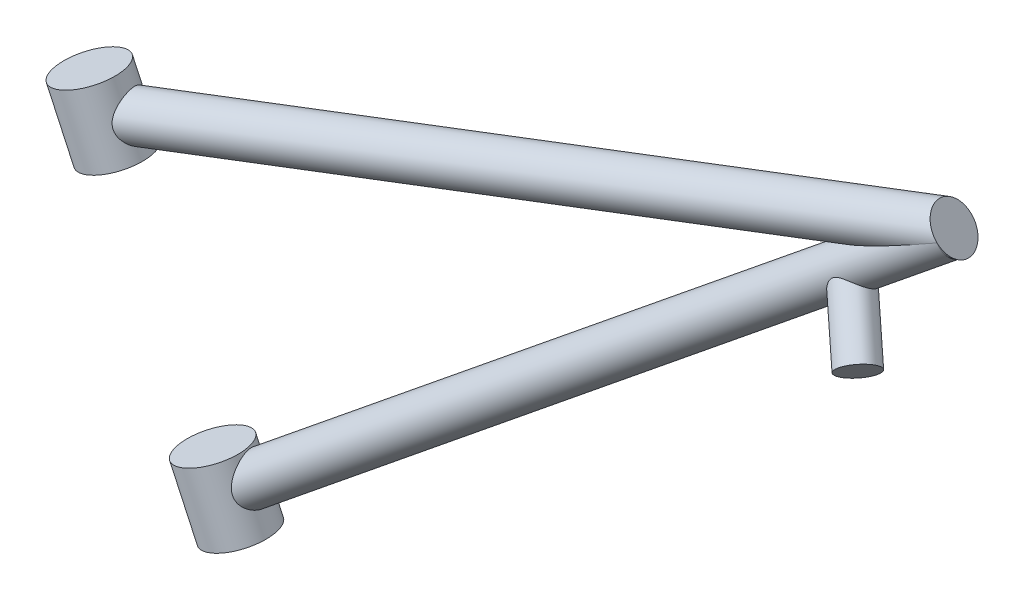
ISO-10303-21;
HEADER;
FILE_DESCRIPTION(('STEP AP214'),'2;1');
FILE_NAME('part.step','',(''),(''),'','','');
FILE_SCHEMA(('AUTOMOTIVE_DESIGN { 1 0 10303 214 1 1 1 1 }'));
ENDSEC;
DATA;
#1=APPLICATION_CONTEXT('core data for automotive mechanical design processes');
#2=APPLICATION_PROTOCOL_DEFINITION('international standard','automotive_design',2000,#1);
#3=PRODUCT_CONTEXT('',#1,'mechanical');
#4=PRODUCT('Part','Part','',(#3));
#5=PRODUCT_RELATED_PRODUCT_CATEGORY('part','',(#4));
#6=PRODUCT_DEFINITION_FORMATION('','',#4);
#7=PRODUCT_DEFINITION_CONTEXT('part definition',#1,'design');
#8=PRODUCT_DEFINITION('design','',#6,#7);
#9=PRODUCT_DEFINITION_SHAPE('','',#8);
#10=(LENGTH_UNIT() NAMED_UNIT(*) SI_UNIT(.MILLI.,.METRE.));
#11=(NAMED_UNIT(*) PLANE_ANGLE_UNIT() SI_UNIT($,.RADIAN.));
#12=(NAMED_UNIT(*) SI_UNIT($,.STERADIAN.) SOLID_ANGLE_UNIT());
#13=UNCERTAINTY_MEASURE_WITH_UNIT(LENGTH_MEASURE(1.E-05),#10,'distance_accuracy_value','');
#14=(GEOMETRIC_REPRESENTATION_CONTEXT(3) GLOBAL_UNCERTAINTY_ASSIGNED_CONTEXT((#13)) GLOBAL_UNIT_ASSIGNED_CONTEXT((#10,
#11,#12)) REPRESENTATION_CONTEXT('',''));
#15=CARTESIAN_POINT('',(0.,0.,0.));
#16=DIRECTION('',(0.,0.,1.));
#17=DIRECTION('',(1.,0.,0.));
#18=AXIS2_PLACEMENT_3D('',#15,#16,#17);
#19=CARTESIAN_POINT('',(255.,1215.1911,-261.859));
#20=DIRECTION('',(0.781537576244063,0.603543584285104,-0.157905537543319));
#21=DIRECTION('',(-0.611211710509564,0.791467147098332,0.));
#22=AXIS2_PLACEMENT_3D('',#19,#20,#21);
#23=CYLINDRICAL_SURFACE('',#22,9.52500000000002);
#24=CARTESIAN_POINT('',(493.612063998645,1390.16282339824,-303.035341507604));
#25=CARTESIAN_POINT('',(493.521655058716,1390.25973316468,-302.870801580258));
#26=CARTESIAN_POINT('',(493.42173983738,1390.35482608397,-302.710358352888));
#27=CARTESIAN_POINT('',(493.204540538591,1390.54048982308,-302.398760660696));
#28=CARTESIAN_POINT('',(493.08724399081,1390.63105733322,-302.247612976102));
#29=CARTESIAN_POINT('',(492.836827567912,1390.80710235116,-301.955030836847));
#30=CARTESIAN_POINT('',(492.703667752751,1390.89256616166,-301.813622377154));
#31=CARTESIAN_POINT('',(492.423616189445,1391.05756154742,-301.54127693571));
#32=CARTESIAN_POINT('',(492.276717717386,1391.13709018331,-301.410345140184));
#33=CARTESIAN_POINT('',(491.821378988013,1391.36437466075,-301.036130597682));
#34=CARTESIAN_POINT('',(491.495450533516,1391.50279326358,-300.808195508861));
#35=CARTESIAN_POINT('',(490.809679167949,1391.75108962571,-300.392325626896));
#36=CARTESIAN_POINT('',(490.449843081226,1391.8609731114,-300.204382809498));
#37=CARTESIAN_POINT('',(489.859595791814,1392.01015921067,-299.934618166978));
#38=CARTESIAN_POINT('',(489.63702446139,1392.05987915871,-299.841000866515));
#39=CARTESIAN_POINT('',(489.18506708919,1392.14743545838,-299.665147018175));
#40=CARTESIAN_POINT('',(488.955679705792,1392.18526945327,-299.582912729112));
#41=CARTESIAN_POINT('',(488.491570871629,1392.24778309557,-299.428751705965));
#42=CARTESIAN_POINT('',(488.256846344663,1392.2724549454,-299.356831100355));
#43=CARTESIAN_POINT('',(487.783726916595,1392.30683450842,-299.222165906311));
#44=CARTESIAN_POINT('',(487.545333046636,1392.31654635077,-299.159418790202));
#45=CARTESIAN_POINT('',(487.132247509814,1392.3182375197,-299.057878722053));
#46=CARTESIAN_POINT('',(486.958021794932,1392.31435063131,-299.017236671551));
#47=CARTESIAN_POINT('',(486.609274998456,1392.29611309351,-298.939467028408));
#48=CARTESIAN_POINT('',(486.434753869837,1392.28176058296,-298.902340062192));
#49=CARTESIAN_POINT('',(486.086780778601,1392.24106643926,-298.83103382774));
#50=CARTESIAN_POINT('',(485.9133274743,1392.21474596594,-298.796849483161));
#51=CARTESIAN_POINT('',(485.568661858649,1392.14835019628,-298.730696888654));
#52=CARTESIAN_POINT('',(485.397449508775,1392.10827513671,-298.698728600589));
#53=CARTESIAN_POINT('',(484.975749000047,1391.98866529415,-298.620928352942));
#54=CARTESIAN_POINT('',(484.727637918705,1391.89941709534,-298.576001299133));
#55=CARTESIAN_POINT('',(484.369426269337,1391.7354643508,-298.509953641844));
#56=CARTESIAN_POINT('',(484.252420895224,1391.67584930827,-298.48817551775));
#57=CARTESIAN_POINT('',(484.024121721895,1391.54635634231,-298.444961637745));
#58=CARTESIAN_POINT('',(483.912827728927,1391.47647876732,-298.423525870236));
#59=CARTESIAN_POINT('',(483.696587722169,1391.32627727787,-298.380934470149));
#60=CARTESIAN_POINT('',(483.591677606955,1391.24590108778,-298.359780865835));
#61=CARTESIAN_POINT('',(483.389742962618,1391.07566374797,-298.318043967745));
#62=CARTESIAN_POINT('',(483.292718431275,1390.98580260093,-298.29746067381));
#63=CARTESIAN_POINT('',(483.106948725856,1390.79752565859,-298.257121823));
#64=CARTESIAN_POINT('',(483.018213792169,1390.69909956511,-298.237367306102));
#65=CARTESIAN_POINT('',(482.849174198631,1390.49497330348,-298.19904596277));
#66=CARTESIAN_POINT('',(482.768874921917,1390.3892685609,-298.180479897652));
#67=CARTESIAN_POINT('',(482.590921458577,1390.13544491766,-298.138947497858));
#68=CARTESIAN_POINT('',(482.496467572134,1389.98498202238,-298.116591224952));
#69=CARTESIAN_POINT('',(482.320805669777,1389.67602565659,-298.075479229487));
#70=CARTESIAN_POINT('',(482.239605765917,1389.51752734522,-298.056725710748));
#71=CARTESIAN_POINT('',(482.088668397586,1389.19420876456,-298.023509288492));
#72=CARTESIAN_POINT('',(482.018964858196,1389.02937149406,-298.009058985888));
#73=CARTESIAN_POINT('',(481.889763411345,1388.69543989851,-297.985155040927));
#74=CARTESIAN_POINT('',(481.830265488791,1388.52634557975,-297.97570139118));
#75=CARTESIAN_POINT('',(481.689081661151,1388.08905436147,-297.958593435731));
#76=CARTESIAN_POINT('',(481.613750406785,1387.81863487524,-297.954945199087));
#77=CARTESIAN_POINT('',(481.480604135375,1387.2736908079,-297.963117704344));
#78=CARTESIAN_POINT('',(481.422798463111,1386.99916411836,-297.974946681012));
#79=CARTESIAN_POINT('',(481.322014424656,1386.44871759754,-298.015823471519));
#80=CARTESIAN_POINT('',(481.279033799852,1386.17279798497,-298.044868660613));
#81=CARTESIAN_POINT('',(481.20609125916,1385.62194599114,-298.12187061427));
#82=CARTESIAN_POINT('',(481.176124923127,1385.34701330618,-298.169820947359));
#83=CARTESIAN_POINT('',(481.131726196092,1384.8421571375,-298.277428767793));
#84=CARTESIAN_POINT('',(481.115622206209,1384.61176108527,-298.334187510939));
#85=CARTESIAN_POINT('',(481.091522519905,1384.15501717613,-298.463493942863));
#86=CARTESIAN_POINT('',(481.08352537197,1383.92866860165,-298.536038802343));
#87=CARTESIAN_POINT('',(481.075391319834,1383.48218787969,-298.697740465961));
#88=CARTESIAN_POINT('',(481.07524282507,1383.26204704543,-298.78687257937));
#89=CARTESIAN_POINT('',(481.082645531934,1382.82980543722,-298.982613645171));
#90=CARTESIAN_POINT('',(481.090194951708,1382.61770281442,-299.089218548302));
#91=CARTESIAN_POINT('',(481.110644000929,1382.24528972078,-299.297361138692));
#92=CARTESIAN_POINT('',(481.122175003088,1382.08309156331,-299.395663285991));
#93=CARTESIAN_POINT('',(481.15007737358,1381.76680764517,-299.603915294393));
#94=CARTESIAN_POINT('',(481.166447658822,1381.61272007834,-299.713862545647));
#95=CARTESIAN_POINT('',(481.203964317329,1381.31414561115,-299.945294558504));
#96=CARTESIAN_POINT('',(481.225109096941,1381.16965552808,-300.06677546253));
#97=CARTESIAN_POINT('',(481.272080250725,1380.89171336853,-300.320972877297));
#98=CARTESIAN_POINT('',(481.297906682622,1380.75826142818,-300.453689526565));
#99=CARTESIAN_POINT('',(481.354247013299,1380.50313396502,-300.730519110315));
#100=CARTESIAN_POINT('',(481.384786578338,1380.38152925879,-300.87469221183));
#101=CARTESIAN_POINT('',(481.45022468309,1380.15230292704,-301.172845672094));
#102=CARTESIAN_POINT('',(481.485123231129,1380.04468132823,-301.326826049574));
#103=CARTESIAN_POINT('',(481.558984753845,1379.84455694181,-301.643354174111));
#104=CARTESIAN_POINT('',(481.597946923143,1379.75205116766,-301.805900220365));
#105=CARTESIAN_POINT('',(481.679599252123,1379.58294204883,-302.138158597655));
#106=CARTESIAN_POINT('',(481.722289187612,1379.50633774875,-302.307870497409));
#107=CARTESIAN_POINT('',(481.807017820279,1379.37564742416,-302.637334939676));
#108=CARTESIAN_POINT('',(481.848768329743,1379.32015399787,-302.796606198275));
#109=CARTESIAN_POINT('',(481.934770483422,1379.22275122879,-303.118645310648));
#110=CARTESIAN_POINT('',(481.97902295411,1379.18084640588,-303.281414308691));
#111=CARTESIAN_POINT('',(482.069722459258,1379.11050849032,-303.609165298562));
#112=CARTESIAN_POINT('',(482.116168809514,1379.08207122766,-303.774146589097));
#113=CARTESIAN_POINT('',(482.211032565098,1379.03829399321,-304.105326119201));
#114=CARTESIAN_POINT('',(482.259450705741,1379.0229589552,-304.271524793448));
#115=CARTESIAN_POINT('',(482.360896262887,1379.00438748012,-304.613757522003));
#116=CARTESIAN_POINT('',(482.41402799941,1379.00190625667,-304.789801634881));
#117=CARTESIAN_POINT('',(482.522050776636,1379.01035875332,-305.14104826562));
#118=CARTESIAN_POINT('',(482.576942501427,1379.02129775282,-305.316250425037));
#119=CARTESIAN_POINT('',(482.74405837665,1379.07310919261,-305.839267150163));
#120=CARTESIAN_POINT('',(482.858747238726,1379.13297238254,-306.184573353803));
#121=CARTESIAN_POINT('',(483.063633692703,1379.27543651032,-306.774097307754));
#122=CARTESIAN_POINT('',(483.152475757823,1379.34812449933,-307.021321624553));
#123=CARTESIAN_POINT('',(483.333888817275,1379.51509203442,-307.506991111299));
#124=CARTESIAN_POINT('',(483.426459955824,1379.60937241624,-307.745435941023));
#125=CARTESIAN_POINT('',(483.616256506009,1379.81739720676,-308.212494610135));
#126=CARTESIAN_POINT('',(483.713492870374,1379.93118921349,-308.441082655991));
#127=CARTESIAN_POINT('',(483.913602564165,1380.17585233902,-308.886257948464));
#128=CARTESIAN_POINT('',(484.016474441523,1380.30671907019,-309.102848257804));
#129=CARTESIAN_POINT('',(484.2129330345,1380.56170069248,-309.489336849047));
#130=CARTESIAN_POINT('',(484.305437711576,1380.68364374216,-309.661223224987));
#131=CARTESIAN_POINT('',(484.497308179672,1380.93695879802,-309.993955982227));
#132=CARTESIAN_POINT('',(484.596675193763,1381.06833248519,-310.154800385281));
#133=CARTESIAN_POINT('',(484.803993937122,1381.33875551178,-310.463206223301));
#134=CARTESIAN_POINT('',(484.911923031957,1381.47778433473,-310.610800617257));
#135=CARTESIAN_POINT('',(485.138940284887,1381.76195490817,-310.890514760614));
#136=CARTESIAN_POINT('',(485.258020799941,1381.90709243482,-311.022644971243));
#137=CARTESIAN_POINT('',(485.535952201405,1382.23116486421,-311.292977091721));
#138=CARTESIAN_POINT('',(485.697975807171,1382.41099889442,-311.42700309783));
#139=CARTESIAN_POINT('',(485.959084509026,1382.68004050759,-311.601316112062));
#140=CARTESIAN_POINT('',(486.049066428246,1382.7695428933,-311.654939036454));
#141=CARTESIAN_POINT('',(486.235273324489,1382.94739278814,-311.752280502494));
#142=CARTESIAN_POINT('',(486.33149501966,1383.03574087548,-311.796004197223));
#143=CARTESIAN_POINT('',(486.53105351222,1383.21117244031,-311.873021512153));
#144=CARTESIAN_POINT('',(486.634453064138,1383.29823371291,-311.906203775642));
#145=CARTESIAN_POINT('',(486.846843659751,1383.46914945349,-311.960874292487));
#146=CARTESIAN_POINT('',(486.955834392663,1383.55300409926,-311.982363195045));
#147=CARTESIAN_POINT('',(487.178468930265,1383.71680226943,-312.013476153304));
#148=CARTESIAN_POINT('',(487.292116088207,1383.79674288093,-312.023091497589));
#149=CARTESIAN_POINT('',(487.522741536475,1383.95224249669,-312.030741660247));
#150=CARTESIAN_POINT('',(487.639720347487,1384.02780081039,-312.028774658487));
#151=CARTESIAN_POINT('',(487.896498471376,1384.18740882436,-312.012647973748));
#152=CARTESIAN_POINT('',(488.036690529549,1384.2706123887,-311.996403228919));
#153=CARTESIAN_POINT('',(488.318124401459,1384.43142856536,-311.950353848857));
#154=CARTESIAN_POINT('',(488.459366965176,1384.50903665238,-311.920538377786));
#155=CARTESIAN_POINT('',(488.74172017445,1384.65964167655,-311.848844121192));
#156=CARTESIAN_POINT('',(488.882829415678,1384.73262549417,-311.80693273688));
#157=CARTESIAN_POINT('',(489.163376378726,1384.87468554987,-311.712550389379));
#158=CARTESIAN_POINT('',(489.302814492265,1384.94376271839,-311.660081954208));
#159=CARTESIAN_POINT('',(489.663669486001,1385.12029689337,-311.51091774868));
#160=CARTESIAN_POINT('',(489.883156777778,1385.22543505911,-311.406778424303));
#161=CARTESIAN_POINT('',(490.313337016645,1385.43159818573,-311.178174331047));
#162=CARTESIAN_POINT('',(490.524024797816,1385.53262072961,-311.05369782773));
#163=CARTESIAN_POINT('',(490.934894872419,1385.73333519422,-310.786906251866));
#164=CARTESIAN_POINT('',(491.13506308323,1385.83302520439,-310.644568089556));
#165=CARTESIAN_POINT('',(491.522756065259,1386.03297509075,-310.344068283543));
#166=CARTESIAN_POINT('',(491.710283441421,1386.13323484487,-310.185909916758));
#167=CARTESIAN_POINT('',(492.07827087285,1386.34006740467,-309.848311584095));
#168=CARTESIAN_POINT('',(492.25812509116,1386.446730437,-309.66826462487));
#169=CARTESIAN_POINT('',(492.599803074188,1386.66370546152,-309.293707138787));
#170=CARTESIAN_POINT('',(492.761623622858,1386.77401810002,-309.099194042379));
#171=CARTESIAN_POINT('',(493.064109575558,1386.99887907536,-308.697490968816));
#172=CARTESIAN_POINT('',(493.204826726613,1387.11341616394,-308.490333812733));
#173=CARTESIAN_POINT('',(493.46251472968,1387.34744275477,-308.06440563072));
#174=CARTESIAN_POINT('',(493.579497177587,1387.46692980411,-307.84564034232));
#175=CARTESIAN_POINT('',(493.755234666253,1387.67406421763,-307.465898581534));
#176=CARTESIAN_POINT('',(493.82090767327,1387.7604377757,-307.307406845015));
#177=CARTESIAN_POINT('',(493.937974024025,1387.9354862387,-306.986487597569));
#178=CARTESIAN_POINT('',(493.989371098258,1388.02416053579,-306.824061126926));
#179=CARTESIAN_POINT('',(494.076800723873,1388.20355932504,-306.496230998011));
#180=CARTESIAN_POINT('',(494.112834590591,1388.29428364099,-306.330827595874));
#181=CARTESIAN_POINT('',(494.168561361425,1388.47739247508,-305.998173684895));
#182=CARTESIAN_POINT('',(494.188254314522,1388.56977698825,-305.83092318159));
#183=CARTESIAN_POINT('',(494.210584036432,1388.75631583284,-305.494717292019));
#184=CARTESIAN_POINT('',(494.213100911565,1388.8504780133,-305.325758149902));
#185=CARTESIAN_POINT('',(494.200233559925,1389.03927073943,-304.988743838735));
#186=CARTESIAN_POINT('',(494.184847241038,1389.13390133854,-304.820688777638));
#187=CARTESIAN_POINT('',(494.136045147951,1389.32267055171,-304.48733097229));
#188=CARTESIAN_POINT('',(494.102661052394,1389.41680973765,-304.322023916585));
#189=CARTESIAN_POINT('',(494.018118885718,1389.6038909701,-303.995428519854));
#190=CARTESIAN_POINT('',(493.966970437628,1389.69683363657,-303.834138053616));
#191=CARTESIAN_POINT('',(493.866017397331,1389.85224702242,-303.566012493981));
#192=CARTESIAN_POINT('',(493.820695341691,1389.91524675659,-303.457771926105));
#193=CARTESIAN_POINT('',(493.72219231128,1390.04001214071,-303.244260262497));
#194=CARTESIAN_POINT('',(493.669014183188,1390.10177822851,-303.138988107535));
#195=CARTESIAN_POINT('',(493.612063998645,1390.16282339824,-303.035341507604));
#196=B_SPLINE_CURVE_WITH_KNOTS('',3,(#24,#25,#26,#27,#28,#29,#30,#31,#32,#33,#34,#35,#36,#37,
#38,#39,#40,#41,#42,#43,#44,#45,#46,#47,#48,#49,#50,#51,#52,#53,#54,#55,#56,#57,#58,#59,#60,#61,
#62,#63,#64,#65,#66,#67,#68,#69,#70,#71,#72,#73,#74,#75,#76,#77,#78,#79,#80,#81,#82,#83,#84,#85,
#86,#87,#88,#89,#90,#91,#92,#93,#94,#95,#96,#97,#98,#99,#100,#101,#102,#103,#104,#105,#106,#107,
#108,#109,#110,#111,#112,#113,#114,#115,#116,#117,#118,#119,#120,#121,#122,#123,#124,#125,#126,
#127,#128,#129,#130,#131,#132,#133,#134,#135,#136,#137,#138,#139,#140,#141,#142,#143,#144,#145,
#146,#147,#148,#149,#150,#151,#152,#153,#154,#155,#156,#157,#158,#159,#160,#161,#162,#163,#164,
#165,#166,#167,#168,#169,#170,#171,#172,#173,#174,#175,#176,#177,#178,#179,#180,#181,#182,#183,
#184,#185,#186,#187,#188,#189,#190,#191,#192,#193,#194,#195),.UNSPECIFIED.,.T.,.F.,(4,2,2,2,2,2,
2,2,2,2,2,2,2,2,2,2,2,2,2,2,2,2,2,2,2,2,2,2,2,2,2,2,2,2,2,2,2,2,2,2,2,2,2,2,2,2,2,2,2,2,2,2,2,2,
2,2,2,2,2,2,2,2,2,2,2,2,2,2,2,2,2,2,2,2,2,2,2,2,2,2,2,2,2,2,2,4),(0.,0.633672683312134,
1.26780221968627,1.90356350321837,2.53963758302134,3.79775990389186,5.05562955012318,
5.79463339277914,6.53378367178827,7.27337135606788,8.01275486768807,8.54929688643112,
9.08593434338069,9.62162667125537,10.157309778193,10.9561666691331,11.3550685506337,
11.7539568908714,12.1549130551707,12.5558691066355,12.9573140967155,13.3590137286797,
13.8953114853581,14.4319362602692,14.970117297164,15.5082975381219,16.3493229137522,
17.1907959452862,18.0321407207719,18.8731995199452,19.5860524917014,20.2987778060815,
21.0104505679711,21.7219586346124,22.2914534898301,22.8608209813396,23.429998706947,
23.9991834510429,24.5715849326853,25.14398750769,25.7162768514303,26.2885318004091,
26.8092016384214,27.3300444855138,27.8507259563705,28.3716034089351,28.9227633462006,
29.4741401744346,30.5766413030751,31.3934266782145,32.2102436722367,33.0290823777872,
33.8477110816973,34.5376686595539,35.2277495272942,35.9160633061017,36.6039087288639,
37.4308579711963,37.8437779491101,38.2564824832683,38.6734119452436,39.0903182574191,
39.5075302649105,39.9248078378953,40.4155291593051,40.9066429969417,41.3990929596513,
41.8914251390908,42.6843685584256,43.4777711280376,44.2722101036114,45.0664848625269,
45.8933547194968,46.7203718017282,47.5453266031702,48.3698773865932,48.945583748495,
49.5211395286972,50.0966460222505,50.6721507907655,51.2516686663802,51.8312542695523,
52.4098230346112,52.9880788739447,53.3873848011254,53.7865463915886),.UNSPECIFIED.);
#197=CARTESIAN_POINT('',(493.612063998645,1390.16282339824,-303.035341507604));
#198=VERTEX_POINT('',#197);
#199=EDGE_CURVE('E12',#198,#198,#196,.T.);
#200=ORIENTED_EDGE('',*,*,#199,.F.);
#201=EDGE_LOOP('',(#200));
#202=FACE_BOUND('',#201,.T.);
#203=CARTESIAN_POINT('',(262.838951394775,1233.2793541279,-264.619080925519));
#204=CARTESIAN_POINT('',(262.787488912083,1233.23960963134,-264.845638537802));
#205=CARTESIAN_POINT('',(262.734766156125,1233.18797940243,-265.06985083514));
#206=CARTESIAN_POINT('',(262.627589046774,1233.06237559829,-265.511505984077));
#207=CARTESIAN_POINT('',(262.573134236867,1232.9883960881,-265.728947020594));
#208=CARTESIAN_POINT('',(262.463245126695,1232.81984778192,-266.155704773518));
#209=CARTESIAN_POINT('',(262.407809770882,1232.72525537856,-266.365011847761));
#210=CARTESIAN_POINT('',(262.296778678355,1232.51752027692,-266.774251474919));
#211=CARTESIAN_POINT('',(262.241182874403,1232.40436816687,-266.974179204997));
#212=CARTESIAN_POINT('',(262.131227132889,1232.16299230164,-267.3616645291));
#213=CARTESIAN_POINT('',(262.076860335818,1232.03495700079,-267.549338012237));
#214=CARTESIAN_POINT('',(261.969383342736,1231.76471398586,-267.914445194079));
#215=CARTESIAN_POINT('',(261.916273008021,1231.62250784526,-268.091880026208));
#216=CARTESIAN_POINT('',(261.759709340368,1231.17713819969,-268.608817514082));
#217=CARTESIAN_POINT('',(261.658977139047,1230.85512140389,-268.93311259187));
#218=CARTESIAN_POINT('',(261.491110823488,1230.25058151678,-269.472296117696));
#219=CARTESIAN_POINT('',(261.421548847692,1229.97575906064,-269.695283472507));
#220=CARTESIAN_POINT('',(261.291571045418,1229.40695316772,-270.118656212909));
#221=CARTESIAN_POINT('',(261.231159635429,1229.11296057584,-270.319030672642));
#222=CARTESIAN_POINT('',(261.121714043653,1228.50859368574,-270.698296225301));
#223=CARTESIAN_POINT('',(261.072704182818,1228.19818607108,-270.877141007853));
#224=CARTESIAN_POINT('',(260.988904318178,1227.56427372847,-271.2135274139));
#225=CARTESIAN_POINT('',(260.954110539792,1227.24077250217,-271.37107468476));
#226=CARTESIAN_POINT('',(260.905791214113,1226.63119425343,-271.643640566902));
#227=CARTESIAN_POINT('',(260.889897100657,1226.34657517979,-271.761508464038));
#228=CARTESIAN_POINT('',(260.873247996112,1225.77092711143,-271.981843088168));
#229=CARTESIAN_POINT('',(260.872494086979,1225.47989766009,-272.08430871396));
#230=CARTESIAN_POINT('',(260.888943696537,1224.89390026101,-272.273083975397));
#231=CARTESIAN_POINT('',(260.906102222723,1224.59894400961,-272.359433450916));
#232=CARTESIAN_POINT('',(260.961485556871,1224.00658034386,-272.515333916919));
#233=CARTESIAN_POINT('',(260.999701385954,1223.70917402745,-272.584892049099));
#234=CARTESIAN_POINT('',(261.085868135149,1223.2007674873,-272.688317350928));
#235=CARTESIAN_POINT('',(261.127806290087,1222.98965573423,-272.726688576747));
#236=CARTESIAN_POINT('',(261.225015861238,1222.5689685597,-272.793594100112));
#237=CARTESIAN_POINT('',(261.280283320192,1222.35939270124,-272.822131311126));
#238=CARTESIAN_POINT('',(261.404898040282,1221.9435056547,-272.868644322438));
#239=CARTESIAN_POINT('',(261.474229396097,1221.73719105997,-272.886631964951));
#240=CARTESIAN_POINT('',(261.627401295693,1221.32930061089,-272.911378625542));
#241=CARTESIAN_POINT('',(261.711241743017,1221.12772472506,-272.918137718266));
#242=CARTESIAN_POINT('',(261.893808199368,1220.7298887279,-272.91978693978));
#243=CARTESIAN_POINT('',(261.992620798171,1220.53366793227,-272.914605357723));
#244=CARTESIAN_POINT('',(262.20393287097,1220.14949526974,-272.891723145007));
#245=CARTESIAN_POINT('',(262.316432420639,1219.96154344855,-272.874022445129));
#246=CARTESIAN_POINT('',(262.553762891191,1219.5951669796,-272.825794089136));
#247=CARTESIAN_POINT('',(262.678601412381,1219.41674830942,-272.795258489107));
#248=CARTESIAN_POINT('',(262.938675939501,1219.07049988645,-272.721277667204));
#249=CARTESIAN_POINT('',(263.073911982618,1218.90267017153,-272.677832399154));
#250=CARTESIAN_POINT('',(263.34253341136,1218.58987117151,-272.581752175503));
#251=CARTESIAN_POINT('',(263.475341028139,1218.44412675275,-272.530012796745));
#252=CARTESIAN_POINT('',(263.746392410373,1218.16218181107,-272.415662719547));
#253=CARTESIAN_POINT('',(263.884638252454,1218.02598499031,-272.353047836427));
#254=CARTESIAN_POINT('',(264.164834442923,1217.76306639412,-272.217179290291));
#255=CARTESIAN_POINT('',(264.306784758104,1217.6363445338,-272.143925722614));
#256=CARTESIAN_POINT('',(264.592831545141,1217.39208914233,-271.987011177331));
#257=CARTESIAN_POINT('',(264.736928283074,1217.27455676181,-271.903348899817));
#258=CARTESIAN_POINT('',(265.048974370245,1217.03021072537,-271.711625717096));
#259=CARTESIAN_POINT('',(265.217044038552,1216.90493007947,-271.601803562996));
#260=CARTESIAN_POINT('',(265.552041701595,1216.66574357875,-271.368845679716));
#261=CARTESIAN_POINT('',(265.718969610425,1216.55183857127,-271.245708960189));
#262=CARTESIAN_POINT('',(266.04990651525,1216.33482819055,-270.986416921671));
#263=CARTESIAN_POINT('',(266.213913700874,1216.23172933436,-270.850253840266));
#264=CARTESIAN_POINT('',(266.537179347297,1216.03597662487,-270.565361736146));
#265=CARTESIAN_POINT('',(266.696437604075,1215.94332321984,-270.416632174604));
#266=CARTESIAN_POINT('',(267.032769881571,1215.75455430349,-270.08305163766));
#267=CARTESIAN_POINT('',(267.20878570419,1215.66012292821,-269.896173006199));
#268=CARTESIAN_POINT('',(267.550010294746,1215.4843745235,-269.5069814635));
#269=CARTESIAN_POINT('',(267.71521800719,1215.40305877377,-269.304667049011));
#270=CARTESIAN_POINT('',(268.032625637482,1215.25334266906,-268.885557126569));
#271=CARTESIAN_POINT('',(268.184825695961,1215.18494217445,-268.668761775222));
#272=CARTESIAN_POINT('',(268.474167899431,1215.06097546655,-268.22185970752));
#273=CARTESIAN_POINT('',(268.611310768177,1215.00540863624,-267.991753631783));
#274=CARTESIAN_POINT('',(268.867314361396,1214.90762909878,-267.522141024314));
#275=CARTESIAN_POINT('',(268.986353700318,1214.8652808968,-267.282760208693));
#276=CARTESIAN_POINT('',(269.206288873602,1214.79319294814,-266.793959576144));
#277=CARTESIAN_POINT('',(269.30718462866,1214.76345325658,-266.544539715342));
#278=CARTESIAN_POINT('',(269.489484982285,1214.71665171558,-266.037625969677));
#279=CARTESIAN_POINT('',(269.570897218449,1214.69958489279,-265.780135293513));
#280=CARTESIAN_POINT('',(269.713302590632,1214.67815515319,-265.259057225066));
#281=CARTESIAN_POINT('',(269.774296938499,1214.67379148228,-264.995470195609));
#282=CARTESIAN_POINT('',(269.871839749245,1214.67764071711,-264.482487671243));
#283=CARTESIAN_POINT('',(269.909769232333,1214.68501804567,-264.233346968567));
#284=CARTESIAN_POINT('',(269.967219054953,1214.71079231217,-263.733529520292));
#285=CARTESIAN_POINT('',(269.986740330676,1214.72918868962,-263.482852853462));
#286=CARTESIAN_POINT('',(270.007510545185,1214.77695659943,-262.981813315129));
#287=CARTESIAN_POINT('',(270.008760681925,1214.80632741212,-262.73145042413));
#288=CARTESIAN_POINT('',(269.993416415853,1214.8759933491,-262.232803804385));
#289=CARTESIAN_POINT('',(269.97682166742,1214.91628868497,-261.984520116002));
#290=CARTESIAN_POINT('',(269.92651808642,1215.00767742209,-261.492196146515));
#291=CARTESIAN_POINT('',(269.892841170333,1215.0587505824,-261.248148826442));
#292=CARTESIAN_POINT('',(269.809294962508,1215.171733097,-260.765405356451));
#293=CARTESIAN_POINT('',(269.7594257712,1215.23364238408,-260.526709173355));
#294=CARTESIAN_POINT('',(269.64456330906,1215.36838004246,-260.056027271236));
#295=CARTESIAN_POINT('',(269.579563563451,1215.44121308358,-259.824044472972));
#296=CARTESIAN_POINT('',(269.435705289193,1215.59791936035,-259.368244226412));
#297=CARTESIAN_POINT('',(269.356845925137,1215.68179326142,-259.144427271306));
#298=CARTESIAN_POINT('',(269.180944007928,1215.86684246029,-258.691509887527));
#299=CARTESIAN_POINT('',(269.083035630228,1215.96880167509,-258.463065230749));
#300=CARTESIAN_POINT('',(268.874892178652,1216.18602331427,-258.018417934787));
#301=CARTESIAN_POINT('',(268.764655961191,1216.30128697288,-257.80221643414));
#302=CARTESIAN_POINT('',(268.533931094169,1216.54572350427,-257.383559134057));
#303=CARTESIAN_POINT('',(268.413441976074,1216.67489701279,-257.181103963559));
#304=CARTESIAN_POINT('',(268.164532821564,1216.94788401483,-256.791530222112));
#305=CARTESIAN_POINT('',(268.036114013402,1217.0916952433,-256.604409286397));
#306=CARTESIAN_POINT('',(267.793377314951,1217.37230278892,-256.273652423399));
#307=CARTESIAN_POINT('',(267.679789221619,1217.50698155258,-256.127681330157));
#308=CARTESIAN_POINT('',(267.450556159001,1217.78799825071,-255.849216671703));
#309=CARTESIAN_POINT('',(267.334911580019,1217.93433399075,-255.71672058046));
#310=CARTESIAN_POINT('',(267.103663587377,1218.23882626043,-255.466517963171));
#311=CARTESIAN_POINT('',(266.988060285359,1218.39696868027,-255.348794220479));
#312=CARTESIAN_POINT('',(266.7588792887,1218.72527772479,-255.129146691948));
#313=CARTESIAN_POINT('',(266.64530157164,1218.89544421629,-255.027222731146));
#314=CARTESIAN_POINT('',(266.421479341049,1219.24881295909,-254.839542731904));
#315=CARTESIAN_POINT('',(266.311267533011,1219.43210612179,-254.753918295753));
#316=CARTESIAN_POINT('',(266.097225957495,1219.80964125873,-254.600698634876));
#317=CARTESIAN_POINT('',(265.993396011045,1220.00388292564,-254.533102904379));
#318=CARTESIAN_POINT('',(265.793930023665,1220.4018141094,-254.416416425591));
#319=CARTESIAN_POINT('',(265.698291371447,1220.60550058319,-254.367319762918));
#320=CARTESIAN_POINT('',(265.516420239314,1221.02051539761,-254.287556839996));
#321=CARTESIAN_POINT('',(265.43018744482,1221.23184348235,-254.256889963203));
#322=CARTESIAN_POINT('',(265.277275457421,1221.63490927169,-254.215996479137));
#323=CARTESIAN_POINT('',(265.209489237462,1221.82603248896,-254.203792103287));
#324=CARTESIAN_POINT('',(265.081687940328,1222.21126676639,-254.192682882228));
#325=CARTESIAN_POINT('',(265.021675649567,1222.40537887011,-254.193782792425));
#326=CARTESIAN_POINT('',(264.852872618614,1222.99039638325,-254.215948060444));
#327=CARTESIAN_POINT('',(264.755319345828,1223.38397325166,-254.255879859834));
#328=CARTESIAN_POINT('',(264.603559116246,1224.08622905702,-254.366532715557));
#329=CARTESIAN_POINT('',(264.544549491268,1224.39530774095,-254.428984553368));
#330=CARTESIAN_POINT('',(264.439316417604,1225.00982667488,-254.578516399173));
#331=CARTESIAN_POINT('',(264.393099745884,1225.31526491472,-254.665609411429));
#332=CARTESIAN_POINT('',(264.310585550335,1225.92080879213,-254.862539130422));
#333=CARTESIAN_POINT('',(264.274311459421,1226.22090029962,-254.9724285123));
#334=CARTESIAN_POINT('',(264.209205154447,1226.81322714491,-255.213327325015));
#335=CARTESIAN_POINT('',(264.18037179436,1227.10546368632,-255.344333498377));
#336=CARTESIAN_POINT('',(264.126861571061,1227.6909452326,-255.631676488492));
#337=CARTESIAN_POINT('',(264.102374042528,1227.98384027776,-255.788761346375));
#338=CARTESIAN_POINT('',(264.056593810726,1228.5575828752,-256.124087249875));
#339=CARTESIAN_POINT('',(264.035301525144,1228.838428849,-256.302331055983));
#340=CARTESIAN_POINT('',(263.993886241375,1229.38539599799,-256.679478747211));
#341=CARTESIAN_POINT('',(263.973761568069,1229.65153824033,-256.878351833285));
#342=CARTESIAN_POINT('',(263.932762314084,1230.16680192681,-257.296947853842));
#343=CARTESIAN_POINT('',(263.911887958349,1230.41592841254,-257.516664566066));
#344=CARTESIAN_POINT('',(263.872915779725,1230.83663726232,-257.92185597277));
#345=CARTESIAN_POINT('',(263.855349350688,1231.01250718154,-258.1029383062));
#346=CARTESIAN_POINT('',(263.818002798452,1231.35080736688,-258.47718838374));
#347=CARTESIAN_POINT('',(263.798222058689,1231.51323386774,-258.670359487273));
#348=CARTESIAN_POINT('',(263.75576035649,1231.82240778724,-259.068306187249));
#349=CARTESIAN_POINT('',(263.733082210569,1231.96917018168,-259.273070408007));
#350=CARTESIAN_POINT('',(263.684164838329,1232.24484302067,-259.693768519557));
#351=CARTESIAN_POINT('',(263.657927906659,1232.37376486119,-259.909695157931));
#352=CARTESIAN_POINT('',(263.606649972267,1232.58900319281,-260.310258052099));
#353=CARTESIAN_POINT('',(263.582313730091,1232.67877132676,-260.493132077823));
#354=CARTESIAN_POINT('',(263.53068645592,1232.84360306258,-260.864914890735));
#355=CARTESIAN_POINT('',(263.503396878717,1232.91867385352,-261.053820674684));
#356=CARTESIAN_POINT('',(263.445711659866,1233.05281782878,-261.43665444677));
#357=CARTESIAN_POINT('',(263.415317964201,1233.11190095206,-261.630579232231));
#358=CARTESIAN_POINT('',(263.351351978591,1233.21297617185,-262.022333959908));
#359=CARTESIAN_POINT('',(263.317779882659,1233.25496931072,-262.22016366318));
#360=CARTESIAN_POINT('',(263.250421112757,1233.31824421341,-262.601822384237));
#361=CARTESIAN_POINT('',(263.216880825641,1233.3409492907,-262.785459383674));
#362=CARTESIAN_POINT('',(263.147321471364,1233.37078698005,-263.153518340142));
#363=CARTESIAN_POINT('',(263.111302636942,1233.37792105221,-263.33794022195));
#364=CARTESIAN_POINT('',(263.037005599006,1233.37647469225,-263.7062967006));
#365=CARTESIAN_POINT('',(262.998727061325,1233.36789193025,-263.890231221147));
#366=CARTESIAN_POINT('',(262.920216736431,1233.33517773641,-264.256301321555));
#367=CARTESIAN_POINT('',(262.879984679328,1233.31104415045,-264.43843664864));
#368=CARTESIAN_POINT('',(262.838951394775,1233.2793541279,-264.619080925519));
#369=B_SPLINE_CURVE_WITH_KNOTS('',3,(#203,#204,#205,#206,#207,#208,#209,#210,#211,#212,#213,
#214,#215,#216,#217,#218,#219,#220,#221,#222,#223,#224,#225,#226,#227,#228,#229,#230,#231,#232,
#233,#234,#235,#236,#237,#238,#239,#240,#241,#242,#243,#244,#245,#246,#247,#248,#249,#250,#251,
#252,#253,#254,#255,#256,#257,#258,#259,#260,#261,#262,#263,#264,#265,#266,#267,#268,#269,#270,
#271,#272,#273,#274,#275,#276,#277,#278,#279,#280,#281,#282,#283,#284,#285,#286,#287,#288,#289,
#290,#291,#292,#293,#294,#295,#296,#297,#298,#299,#300,#301,#302,#303,#304,#305,#306,#307,#308,
#309,#310,#311,#312,#313,#314,#315,#316,#317,#318,#319,#320,#321,#322,#323,#324,#325,#326,#327,
#328,#329,#330,#331,#332,#333,#334,#335,#336,#337,#338,#339,#340,#341,#342,#343,#344,#345,#346,
#347,#348,#349,#350,#351,#352,#353,#354,#355,#356,#357,#358,#359,#360,#361,#362,#363,#364,#365,
#366,#367,#368),.UNSPECIFIED.,.T.,.F.,(4,2,2,2,2,2,2,2,2,2,2,2,2,2,2,2,2,2,2,2,2,2,2,2,2,2,2,2,
2,2,2,2,2,2,2,2,2,2,2,2,2,2,2,2,2,2,2,2,2,2,2,2,2,2,2,2,2,2,2,2,2,2,2,2,2,2,2,2,2,2,2,2,2,2,2,2,
2,2,2,2,2,2,4),(0.,0.706867703805031,1.4139232851994,2.12179293388452,2.83002266507531,
3.53010110138962,4.2301018893239,5.6295241835048,6.71032866882562,7.79165314992583,
8.87526350567644,9.95858595939272,10.8832483239009,11.8079767667699,12.7303880499603,
13.6524063190207,14.3077440869664,14.9628875344211,15.617294148631,16.2716964124894,
16.9300389847291,17.5883851970146,18.2471394813914,18.9058961220553,19.5168518591243,
20.1280432028951,20.7392290697808,21.3504913423179,22.0597535021418,22.7690684537149,
23.4788087509051,24.1885794958715,25.0082174863642,25.8279354014961,26.6476444531449,
27.4673140865753,28.278282793382,29.0892550447529,29.8999088699604,30.7105145724803,
31.4659620457393,32.221371096927,32.9767306192732,33.7321047717538,34.4860727464939,
35.2400360449529,35.9943225799192,36.7486545960793,37.5536807582735,38.3587816602948,
39.1639193733671,39.96893268765,40.6546746185071,41.3402877619278,42.0250942758878,
42.7098932059011,43.4000062371711,44.0900999062315,44.7799727561764,45.4698225260783,
46.0786445814971,46.6876842570772,47.9057946040425,48.8670145492772,49.8287427229667,
50.7927184033327,51.7565455228858,52.7554305464275,53.7544460324934,54.7519909114059,
55.7492389338123,56.5077820881865,57.2665369830313,58.024559840044,58.7820962390697,
59.3970169754651,60.0116361732986,60.6258724021526,61.2400711614882,61.8035788767184,
62.3670337497585,62.9305721565556,63.4941886420775),.UNSPECIFIED.);
#370=CARTESIAN_POINT('',(262.838951394775,1233.2793541279,-264.619080925519));
#371=VERTEX_POINT('',#370);
#372=EDGE_CURVE('E108',#371,#371,#369,.T.);
#373=ORIENTED_EDGE('',*,*,#372,.F.);
#374=EDGE_LOOP('',(#373));
#375=FACE_BOUND('',#374,.T.);
#376=CARTESIAN_POINT('',(519.692129,1419.6,-315.338646));
#377=DIRECTION('',(0.883977158036266,0.432175870584589,-0.178349098552753));
#378=DIRECTION('',(-0.423857121616073,0.901788794577755,0.0843925970055212));
#379=AXIS2_PLACEMENT_3D('',#376,#377,#378);
#380=ELLIPSE('',#379,9.72076999108081,9.52500000000002);
#381=CARTESIAN_POINT('',(521.571465437024,1419.60946220639,-306.000893057074));
#382=VERTEX_POINT('',#381);
#383=CARTESIAN_POINT('',(517.812792562976,1419.59053779361,-324.676398942926));
#384=VERTEX_POINT('',#383);
#385=EDGE_CURVE('E91',#382,#384,#380,.T.);
#386=ORIENTED_EDGE('',*,*,#385,.F.);
#387=CARTESIAN_POINT('',(519.692129,1419.6,-315.338646));
#388=DIRECTION('',(-0.423857121616073,0.901788794577755,0.0843925970055212));
#389=DIRECTION('',(0.883977158036266,0.432175870584589,-0.178349098552753));
#390=AXIS2_PLACEMENT_3D('',#387,#388,#389);
#391=ELLIPSE('',#390,47.7007212097638,9.52500000000002);
#392=EDGE_CURVE('E98',#384,#382,#391,.T.);
#393=ORIENTED_EDGE('',*,*,#392,.F.);
#394=EDGE_LOOP('',(#386,#393));
#395=FACE_BOUND('',#394,.T.);
#396=ADVANCED_FACE('F73',(#202,#375,#395),#23,.T.);
#397=CARTESIAN_POINT('',(210.,1340.3211,-252.929));
#398=DIRECTION('',(0.950811288716433,0.243400674471197,-0.191608989654355));
#399=DIRECTION('',(-0.247995702030152,0.968761132464847,0.));
#400=AXIS2_PLACEMENT_3D('',#397,#398,#399);
#401=CYLINDRICAL_SURFACE('',#400,9.52500000000001);
#402=CARTESIAN_POINT('',(220.058204559034,1352.7280712316,-255.431971254945));
#403=CARTESIAN_POINT('',(220.005392407876,1352.71455144215,-255.675172910199));
#404=CARTESIAN_POINT('',(219.949672265575,1352.69018530344,-255.917143478642));
#405=CARTESIAN_POINT('',(219.833046118016,1352.62013831825,-256.39670499037));
#406=CARTESIAN_POINT('',(219.772139958358,1352.57445683697,-256.634295803002));
#407=CARTESIAN_POINT('',(219.645920561364,1352.46244175126,-257.103442969339));
#408=CARTESIAN_POINT('',(219.580605725039,1352.39610062189,-257.334997090919));
#409=CARTESIAN_POINT('',(219.446526771884,1352.24369646172,-257.790473249095));
#410=CARTESIAN_POINT('',(219.377762638219,1352.15763333467,-258.014395248434));
#411=CARTESIAN_POINT('',(219.238152903468,1351.96732190144,-258.452335223492));
#412=CARTESIAN_POINT('',(219.167318452729,1351.86315991026,-258.666394367089));
#413=CARTESIAN_POINT('',(219.024370701445,1351.63754980802,-259.084730389211));
#414=CARTESIAN_POINT('',(218.95225740569,1351.51610176169,-259.289007304363));
#415=CARTESIAN_POINT('',(218.80791696967,1351.25710947308,-259.687039301059));
#416=CARTESIAN_POINT('',(218.735689824844,1351.11956456897,-259.880793949491));
#417=CARTESIAN_POINT('',(218.592323756214,1350.82949416685,-260.257301479708));
#418=CARTESIAN_POINT('',(218.521185343198,1350.6769618722,-260.440049308842));
#419=CARTESIAN_POINT('',(218.375522541186,1350.34484400541,-260.808751035792));
#420=CARTESIAN_POINT('',(218.301207227216,1350.1640637983,-260.993711963489));
#421=CARTESIAN_POINT('',(218.157218489466,1349.7877044449,-261.349718042994));
#422=CARTESIAN_POINT('',(218.08754359691,1349.5921300235,-261.520767601828));
#423=CARTESIAN_POINT('',(217.954703437273,1349.18722979448,-261.848850061838));
#424=CARTESIAN_POINT('',(217.891542898309,1348.97789417692,-262.005872771416));
#425=CARTESIAN_POINT('',(217.773957326803,1348.54681174873,-262.305476071761));
#426=CARTESIAN_POINT('',(217.719531492785,1348.32506607935,-262.44805798714));
#427=CARTESIAN_POINT('',(217.62610080119,1347.8902248545,-262.706667530965));
#428=CARTESIAN_POINT('',(217.58616497513,1347.67806165785,-262.823926552921));
#429=CARTESIAN_POINT('',(217.517641775494,1347.24547027295,-263.045822049763));
#430=CARTESIAN_POINT('',(217.489052621751,1347.02504338712,-263.150460502883));
#431=CARTESIAN_POINT('',(217.445450691621,1346.57742877994,-263.346593891321));
#432=CARTESIAN_POINT('',(217.430420072762,1346.35025035145,-263.438105966566));
#433=CARTESIAN_POINT('',(217.416140707708,1345.89041987804,-263.607637111161));
#434=CARTESIAN_POINT('',(217.416888555101,1345.6577690254,-263.68565908922));
#435=CARTESIAN_POINT('',(217.434613959073,1345.22920834433,-263.815464665237));
#436=CARTESIAN_POINT('',(217.448783051929,1345.03384824855,-263.869453243242));
#437=CARTESIAN_POINT('',(217.490386948374,1344.64206120882,-263.96748131118));
#438=CARTESIAN_POINT('',(217.517818985011,1344.44563449583,-264.011522873476));
#439=CARTESIAN_POINT('',(217.586579294778,1344.05335858349,-264.089368398399));
#440=CARTESIAN_POINT('',(217.627895201597,1343.85750902611,-264.123181420799));
#441=CARTESIAN_POINT('',(217.724638422249,1343.46778150501,-264.180455543878));
#442=CARTESIAN_POINT('',(217.780065952849,1343.27390357163,-264.203916485526));
#443=CARTESIAN_POINT('',(217.90473211486,1342.88964220682,-264.240446639979));
#444=CARTESIAN_POINT('',(217.973970964075,1342.69925883054,-264.253515688889));
#445=CARTESIAN_POINT('',(218.125470575064,1342.32332440926,-264.269361137485));
#446=CARTESIAN_POINT('',(218.207731232219,1342.13777332544,-264.272137619858));
#447=CARTESIAN_POINT('',(218.38418773323,1341.77237079285,-264.267613183625));
#448=CARTESIAN_POINT('',(218.47839460498,1341.59252480487,-264.260302891219));
#449=CARTESIAN_POINT('',(218.677316712219,1341.23933571464,-264.235878308205));
#450=CARTESIAN_POINT('',(218.78203795424,1341.06599640802,-264.218758387077));
#451=CARTESIAN_POINT('',(219.035655987962,1340.67155571323,-264.167980659465));
#452=CARTESIAN_POINT('',(219.187912960041,1340.45306508909,-264.130771195546));
#453=CARTESIAN_POINT('',(219.504679226834,1340.02858372262,-264.040459657719));
#454=CARTESIAN_POINT('',(219.669193506108,1339.82259812807,-263.987351091488));
#455=CARTESIAN_POINT('',(220.007514257624,1339.42271627448,-263.865721443));
#456=CARTESIAN_POINT('',(220.181333605791,1339.22883761594,-263.797178560032));
#457=CARTESIAN_POINT('',(220.535226801556,1338.85311743009,-263.645105031879));
#458=CARTESIAN_POINT('',(220.715300171259,1338.67127498611,-263.561575529863));
#459=CARTESIAN_POINT('',(221.083909847454,1338.31468170034,-263.377381454226));
#460=CARTESIAN_POINT('',(221.272544787306,1338.14023168271,-263.276332880884));
#461=CARTESIAN_POINT('',(221.651429222478,1337.80318671311,-263.058685742175));
#462=CARTESIAN_POINT('',(221.841678774586,1337.64059218007,-262.942086627735));
#463=CARTESIAN_POINT('',(222.22149985588,1337.32715573058,-262.693282170819));
#464=CARTESIAN_POINT('',(222.411071624119,1337.176309177,-262.561083038317));
#465=CARTESIAN_POINT('',(222.787473297266,1336.88634326458,-262.280857726494));
#466=CARTESIAN_POINT('',(222.974303293541,1336.74722351422,-262.132832075948));
#467=CARTESIAN_POINT('',(223.34090890905,1336.48254502107,-261.82258569817));
#468=CARTESIAN_POINT('',(223.520741705866,1336.35684582294,-261.660552751031));
#469=CARTESIAN_POINT('',(223.873504086644,1336.11763370838,-261.320677971994));
#470=CARTESIAN_POINT('',(224.046433395195,1336.00412127784,-261.142835510294));
#471=CARTESIAN_POINT('',(224.382981454466,1335.79006509206,-260.771502782858));
#472=CARTESIAN_POINT('',(224.546607374458,1335.68951127298,-260.578024852184));
#473=CARTESIAN_POINT('',(224.862281348129,1335.50215433677,-260.17557996824));
#474=CARTESIAN_POINT('',(225.014331756029,1335.4153484197,-259.966616181629));
#475=CARTESIAN_POINT('',(225.279177946407,1335.27028108763,-259.571440249272));
#476=CARTESIAN_POINT('',(225.394205266253,1335.20968049955,-259.387578631088));
#477=CARTESIAN_POINT('',(225.613239184441,1335.09914290573,-259.010345242543));
#478=CARTESIAN_POINT('',(225.717247851146,1335.04920389688,-258.816975267052));
#479=CARTESIAN_POINT('',(225.912838602288,1334.96058012592,-258.421679023298));
#480=CARTESIAN_POINT('',(226.004427258667,1334.92188939939,-258.219757354908));
#481=CARTESIAN_POINT('',(226.173993160084,1334.85623559646,-257.808409527615));
#482=CARTESIAN_POINT('',(226.251970262957,1334.82927264256,-257.598983290358));
#483=CARTESIAN_POINT('',(226.393550318186,1334.78738129725,-257.173165021181));
#484=CARTESIAN_POINT('',(226.457092197528,1334.77250337675,-256.95674766115));
#485=CARTESIAN_POINT('',(226.568598417498,1334.75520381533,-256.519442124876));
#486=CARTESIAN_POINT('',(226.616562728996,1334.7527821977,-256.298553940274));
#487=CARTESIAN_POINT('',(226.696469822303,1334.76043561394,-255.854111517752));
#488=CARTESIAN_POINT('',(226.728412331943,1334.77051086009,-255.63055723461));
#489=CARTESIAN_POINT('',(226.776200055963,1334.80300092097,-255.182638925855));
#490=CARTESIAN_POINT('',(226.792045757327,1334.82541536237,-254.958274924945));
#491=CARTESIAN_POINT('',(226.807420525618,1334.88041591257,-254.524936665422));
#492=CARTESIAN_POINT('',(226.807933407207,1334.9122551564,-254.315900636444));
#493=CARTESIAN_POINT('',(226.79561140915,1334.98606462093,-253.89996174686));
#494=CARTESIAN_POINT('',(226.782771962035,1335.02803830457,-253.69305964067));
#495=CARTESIAN_POINT('',(226.744420369864,1335.12164999429,-253.282687642859));
#496=CARTESIAN_POINT('',(226.718910226411,1335.17328647312,-253.07921721438));
#497=CARTESIAN_POINT('',(226.656049269499,1335.28574175814,-252.676662402281));
#498=CARTESIAN_POINT('',(226.618694098146,1335.34656393951,-252.477579661807));
#499=CARTESIAN_POINT('',(226.482441763304,1335.55388243483,-251.852691857103));
#500=CARTESIAN_POINT('',(226.362942017377,1335.7167775333,-251.436590391437));
#501=CARTESIAN_POINT('',(226.082030017462,1336.07934673218,-250.636130702453));
#502=CARTESIAN_POINT('',(225.920606398694,1336.27903080112,-250.251781123774));
#503=CARTESIAN_POINT('',(225.636762335436,1336.62565340611,-249.665013680764));
#504=CARTESIAN_POINT('',(225.524458133929,1336.76187159129,-249.451165715667));
#505=CARTESIAN_POINT('',(225.290409860069,1337.04621465666,-249.036900627955));
#506=CARTESIAN_POINT('',(225.16866473618,1337.19434086325,-248.836485006092));
#507=CARTESIAN_POINT('',(224.917530444045,1337.50271761262,-248.449327992636));
#508=CARTESIAN_POINT('',(224.788123469323,1337.66299666256,-248.262620909734));
#509=CARTESIAN_POINT('',(224.524037951141,1337.99547411669,-247.904140154608));
#510=CARTESIAN_POINT('',(224.389359272193,1338.16767282732,-247.732366866564));
#511=CARTESIAN_POINT('',(224.093481472431,1338.55496975623,-247.37645571703));
#512=CARTESIAN_POINT('',(223.931703479246,1338.77235375684,-247.195268901469));
#513=CARTESIAN_POINT('',(223.60769253784,1339.22469181042,-246.856477745664));
#514=CARTESIAN_POINT('',(223.445459461229,1339.45965143231,-246.698880927917));
#515=CARTESIAN_POINT('',(223.125469689868,1339.94693919771,-246.410368762245));
#516=CARTESIAN_POINT('',(222.967699599225,1340.19920528166,-246.279364127062));
#517=CARTESIAN_POINT('',(222.661017694209,1340.72190108457,-246.046639963052));
#518=CARTESIAN_POINT('',(222.512098337682,1340.99231490803,-245.944895208094));
#519=CARTESIAN_POINT('',(222.281047047807,1341.44650927626,-245.805935489851));
#520=CARTESIAN_POINT('',(222.194663226567,1341.62513557204,-245.758791485306));
#521=CARTESIAN_POINT('',(222.028655243883,1341.98850793336,-245.678291820282));
#522=CARTESIAN_POINT('',(221.949028960132,1342.17325205197,-245.644931817896));
#523=CARTESIAN_POINT('',(221.79768803214,1342.54772685426,-245.592740824786));
#524=CARTESIAN_POINT('',(221.725964606669,1342.73745170723,-245.573893565887));
#525=CARTESIAN_POINT('',(221.591120470369,1343.12083171554,-245.551147596085));
#526=CARTESIAN_POINT('',(221.528000062282,1343.31448700892,-245.547249411115));
#527=CARTESIAN_POINT('',(221.410743899208,1343.7043676231,-245.554582735125));
#528=CARTESIAN_POINT('',(221.356614751408,1343.90059472055,-245.565825315459));
#529=CARTESIAN_POINT('',(221.257392263565,1344.29388312877,-245.603306940601));
#530=CARTESIAN_POINT('',(221.212298831549,1344.49094443103,-245.629545832751));
#531=CARTESIAN_POINT('',(221.130686996937,1344.88460215803,-245.696623801045));
#532=CARTESIAN_POINT('',(221.094179357878,1345.0811976966,-245.737481043407));
#533=CARTESIAN_POINT('',(221.029070312744,1345.47230429023,-245.833149869254));
#534=CARTESIAN_POINT('',(221.0004706372,1345.66681488009,-245.887964502054));
#535=CARTESIAN_POINT('',(220.943746590878,1346.10235614483,-246.026667167403));
#536=CARTESIAN_POINT('',(220.91765230391,1346.34242834972,-246.114407646529));
#537=CARTESIAN_POINT('',(220.874360333364,1346.81541094311,-246.30924891905));
#538=CARTESIAN_POINT('',(220.857164993926,1347.04831942938,-246.416354803616));
#539=CARTESIAN_POINT('',(220.829489514856,1347.50565403249,-246.648571124493));
#540=CARTESIAN_POINT('',(220.819016065122,1347.73007149038,-246.77369934623));
#541=CARTESIAN_POINT('',(220.802746913124,1348.16892631553,-247.040576978901));
#542=CARTESIAN_POINT('',(220.7969509646,1348.38336420762,-247.182325514363));
#543=CARTESIAN_POINT('',(220.788072547212,1348.80455002335,-247.48373514529));
#544=CARTESIAN_POINT('',(220.785035218459,1349.01111880201,-247.643647663463));
#545=CARTESIAN_POINT('',(220.780047509471,1349.41183009337,-247.978514758798));
#546=CARTESIAN_POINT('',(220.778097568116,1349.60596756075,-248.153475376676));
#547=CARTESIAN_POINT('',(220.773686181646,1349.98062324631,-248.5174534864));
#548=CARTESIAN_POINT('',(220.771224689518,1350.16114021067,-248.706472269204));
#549=CARTESIAN_POINT('',(220.76436326109,1350.50726980603,-249.097534434081));
#550=CARTESIAN_POINT('',(220.759964084947,1350.67288825111,-249.299572682087));
#551=CARTESIAN_POINT('',(220.747218792165,1351.00732715284,-249.741250035118));
#552=CARTESIAN_POINT('',(220.738455626585,1351.17406022021,-249.982465212251));
#553=CARTESIAN_POINT('',(220.715310538215,1351.48535167629,-250.478614270988));
#554=CARTESIAN_POINT('',(220.700927986483,1351.62990758035,-250.733549685454));
#555=CARTESIAN_POINT('',(220.665245785216,1351.89474382234,-251.255026373407));
#556=CARTESIAN_POINT('',(220.643952141794,1352.01504509222,-251.521557396145));
#557=CARTESIAN_POINT('',(220.5934201682,1352.22959493552,-252.064164104054));
#558=CARTESIAN_POINT('',(220.564183806137,1352.32384995121,-252.340237409993));
#559=CARTESIAN_POINT('',(220.503091313359,1352.47025584779,-252.849305396603));
#560=CARTESIAN_POINT('',(220.472637777578,1352.52692135312,-253.081178710934));
#561=CARTESIAN_POINT('',(220.405735622742,1352.62080867398,-253.547967059227));
#562=CARTESIAN_POINT('',(220.369287836916,1352.6580331889,-253.78288166626));
#563=CARTESIAN_POINT('',(220.290413030263,1352.71250322977,-254.253926742571));
#564=CARTESIAN_POINT('',(220.247988390301,1352.72975668605,-254.490056691808));
#565=CARTESIAN_POINT('',(220.157345427358,1352.74405922887,-254.961829714848));
#566=CARTESIAN_POINT('',(220.109126786049,1352.74110720481,-255.197472761177));
#567=CARTESIAN_POINT('',(220.058204559034,1352.7280712316,-255.431971254945));
#568=B_SPLINE_CURVE_WITH_KNOTS('',3,(#402,#403,#404,#405,#406,#407,#408,#409,#410,#411,#412,
#413,#414,#415,#416,#417,#418,#419,#420,#421,#422,#423,#424,#425,#426,#427,#428,#429,#430,#431,
#432,#433,#434,#435,#436,#437,#438,#439,#440,#441,#442,#443,#444,#445,#446,#447,#448,#449,#450,
#451,#452,#453,#454,#455,#456,#457,#458,#459,#460,#461,#462,#463,#464,#465,#466,#467,#468,#469,
#470,#471,#472,#473,#474,#475,#476,#477,#478,#479,#480,#481,#482,#483,#484,#485,#486,#487,#488,
#489,#490,#491,#492,#493,#494,#495,#496,#497,#498,#499,#500,#501,#502,#503,#504,#505,#506,#507,
#508,#509,#510,#511,#512,#513,#514,#515,#516,#517,#518,#519,#520,#521,#522,#523,#524,#525,#526,
#527,#528,#529,#530,#531,#532,#533,#534,#535,#536,#537,#538,#539,#540,#541,#542,#543,#544,#545,
#546,#547,#548,#549,#550,#551,#552,#553,#554,#555,#556,#557,#558,#559,#560,#561,#562,#563,#564,
#565,#566,#567),.UNSPECIFIED.,.T.,.F.,(4,2,2,2,2,2,2,2,2,2,2,2,2,2,2,2,2,2,2,2,2,2,2,2,2,2,2,2,
2,2,2,2,2,2,2,2,2,2,2,2,2,2,2,2,2,2,2,2,2,2,2,2,2,2,2,2,2,2,2,2,2,2,2,2,2,2,2,2,2,2,2,2,2,2,2,2,
2,2,2,2,2,2,4),(0.,0.74746534356985,1.49495294907905,2.24271313397561,2.99047696868689,
3.73476791500564,4.47905607420461,5.22337484623519,5.9680327317801,6.77450062588038,
7.58071203324069,8.3875045308073,9.19422295653243,9.93058129142176,10.6668240541246,
11.4020965323961,12.1372102743686,12.7461149993172,13.3548927476102,13.9631296907926,
14.5713759775516,15.1796318570372,15.7878828499565,16.3966994810848,17.0058659107373,
17.8113520675625,18.617167590534,19.4241285345955,20.2310279504625,21.0585892492404,
21.8861797760251,22.7134419642091,23.5406765215669,24.3581652823375,25.1756866239193,
25.9925691913781,26.8092851753307,27.4841753372534,28.1589385870908,28.8333433867686,
29.5077552298065,30.1849693537673,30.8621847441383,31.5394116382383,32.2166180433301,
32.8502720630975,33.4841429100314,34.117913655611,34.7519178422672,36.1341333650942,
37.5167239725429,38.3479734323399,39.1793156106283,40.0126720972107,40.8460500159283,
41.8226977787928,42.7996563195607,43.77327824289,44.7460582333949,45.3572965186321,
45.9683421191735,46.5787017621702,47.1890828783897,47.7999105648757,48.4107320334312,
49.0223152211909,49.6340321383023,50.4037223977884,51.1736153040975,51.9442732557982,
52.7148906315236,53.4979018518433,54.2812288744111,55.0646279187236,55.8477199075793,
56.7266216564205,57.6056218032005,58.4838600875135,59.3618809532732,60.0829445847264,
60.8039080695978,61.52458516836,62.2453018798824),.UNSPECIFIED.);
#569=CARTESIAN_POINT('',(220.058204559034,1352.7280712316,-255.431971254945));
#570=VERTEX_POINT('',#569);
#571=EDGE_CURVE('E85',#570,#570,#568,.T.);
#572=ORIENTED_EDGE('',*,*,#571,.F.);
#573=EDGE_LOOP('',(#572));
#574=FACE_BOUND('',#573,.T.);
#575=CARTESIAN_POINT('',(519.692129,1419.6,-315.338646));
#576=DIRECTION('',(0.781537576244064,0.603543584285104,-0.157905537543319));
#577=DIRECTION('',(0.591835697126398,-0.797329389280138,-0.118306181567454));
#578=AXIS2_PLACEMENT_3D('',#575,#576,#577);
#579=ELLIPSE('',#578,10.3504056646411,9.52500000000001);
#580=EDGE_CURVE('E96',#382,#384,#579,.F.);
#581=ORIENTED_EDGE('',*,*,#580,.T.);
#582=ORIENTED_EDGE('',*,*,#392,.T.);
#583=EDGE_LOOP('',(#581,#582));
#584=FACE_BOUND('',#583,.T.);
#585=ADVANCED_FACE('F97',(#574,#584),#401,.T.);
#586=EDGE_CURVE('E102',#384,#382,#579,.F.);
#587=ORIENTED_EDGE('',*,*,#586,.T.);
#588=ORIENTED_EDGE('',*,*,#385,.T.);
#589=EDGE_LOOP('',(#587,#588));
#590=FACE_BOUND('',#589,.T.);
#591=ADVANCED_FACE('F107',(#590),#401,.T.);
#592=CARTESIAN_POINT('',(519.692129,1419.6,-315.338646));
#593=DIRECTION('',(0.781537576244064,0.603543584285104,-0.157905537543319));
#594=DIRECTION('',(-0.611211710509564,0.791467147098332,0.));
#595=AXIS2_PLACEMENT_3D('',#592,#593,#594);
#596=PLANE('',#595);
#597=ORIENTED_EDGE('',*,*,#580,.F.);
#598=ORIENTED_EDGE('',*,*,#586,.F.);
#599=EDGE_LOOP('',(#597,#598));
#600=FACE_BOUND('',#599,.T.);
#601=ADVANCED_FACE('F75',(#600),#596,.T.);
#602=CARTESIAN_POINT('',(260.064711,1201.10783,-262.864064));
#603=DIRECTION('',(-0.337647441230119,0.938884781313859,0.0670042748485544));
#604=DIRECTION('',(-0.94099950043385,-0.338407949349961,0.));
#605=AXIS2_PLACEMENT_3D('',#602,#603,#604);
#606=PLANE('',#605);
#607=CARTESIAN_POINT('',(260.064711,1201.10783,-262.864064));
#608=DIRECTION('',(-0.337647441230119,0.938884781313859,0.0670042748485544));
#609=DIRECTION('',(-0.94099950043385,-0.338407949349961,0.));
#610=AXIS2_PLACEMENT_3D('',#607,#608,#609);
#611=CIRCLE('',#610,14.);
#612=CARTESIAN_POINT('',(246.890717993926,1196.3701187091,-262.864064));
#613=VERTEX_POINT('',#612);
#614=EDGE_CURVE('E163',#613,#613,#611,.T.);
#615=ORIENTED_EDGE('',*,*,#614,.F.);
#616=EDGE_LOOP('',(#615));
#617=FACE_BOUND('',#616,.T.);
#618=ADVANCED_FACE('F133',(#617),#606,.F.);
#619=CARTESIAN_POINT('',(249.935289,1229.27437,-260.853936));
#620=DIRECTION('',(-0.337647441230119,0.938884781313859,0.0670042748485544));
#621=DIRECTION('',(-0.94099950043385,-0.338407949349961,0.));
#622=AXIS2_PLACEMENT_3D('',#619,#620,#621);
#623=PLANE('',#622);
#624=CARTESIAN_POINT('',(249.935289,1229.27437,-260.853936));
#625=DIRECTION('',(-0.337647441230119,0.938884781313859,0.0670042748485544));
#626=DIRECTION('',(-0.94099950043385,-0.338407949349961,0.));
#627=AXIS2_PLACEMENT_3D('',#624,#625,#626);
#628=CIRCLE('',#627,14.);
#629=CARTESIAN_POINT('',(236.761295993926,1224.5366587091,-260.853936));
#630=VERTEX_POINT('',#629);
#631=EDGE_CURVE('E106',#630,#630,#628,.T.);
#632=ORIENTED_EDGE('',*,*,#631,.T.);
#633=EDGE_LOOP('',(#632));
#634=FACE_BOUND('',#633,.T.);
#635=ADVANCED_FACE('F128',(#634),#623,.T.);
#636=CARTESIAN_POINT('',(260.064711,1201.10783,-262.864064));
#637=DIRECTION('',(-0.337647441230119,0.938884781313859,0.0670042748485567));
#638=DIRECTION('',(-0.940999500433849,-0.338407949349961,0.));
#639=AXIS2_PLACEMENT_3D('',#636,#637,#638);
#640=CYLINDRICAL_SURFACE('',#639,14.);
#641=ORIENTED_EDGE('',*,*,#372,.T.);
#642=EDGE_LOOP('',(#641));
#643=FACE_BOUND('',#642,.T.);
#644=ORIENTED_EDGE('',*,*,#631,.F.);
#645=EDGE_LOOP('',(#644));
#646=FACE_BOUND('',#645,.T.);
#647=ORIENTED_EDGE('',*,*,#614,.T.);
#648=EDGE_LOOP('',(#647));
#649=FACE_BOUND('',#648,.T.);
#650=ADVANCED_FACE('F122',(#643,#646,#649),#640,.T.);
#651=CARTESIAN_POINT('',(215.064711,1326.23783,-253.934064));
#652=DIRECTION('',(-0.337647441230126,0.938884781313856,0.0670042748485613));
#653=DIRECTION('',(-0.940999500433847,-0.338407949349968,0.));
#654=AXIS2_PLACEMENT_3D('',#651,#652,#653);
#655=PLANE('',#654);
#656=CARTESIAN_POINT('',(215.064711,1326.23783,-253.934064));
#657=DIRECTION('',(-0.337647441230126,0.938884781313856,0.0670042748485613));
#658=DIRECTION('',(-0.940999500433847,-0.338407949349968,0.));
#659=AXIS2_PLACEMENT_3D('',#656,#657,#658);
#660=CIRCLE('',#659,14.);
#661=CARTESIAN_POINT('',(201.890717993926,1321.5001187091,-253.934064));
#662=VERTEX_POINT('',#661);
#663=EDGE_CURVE('E159',#662,#662,#660,.T.);
#664=ORIENTED_EDGE('',*,*,#663,.F.);
#665=EDGE_LOOP('',(#664));
#666=FACE_BOUND('',#665,.T.);
#667=ADVANCED_FACE('F127',(#666),#655,.F.);
#668=CARTESIAN_POINT('',(204.935289,1354.40437,-251.923936));
#669=DIRECTION('',(-0.337647441230126,0.938884781313856,0.0670042748485613));
#670=DIRECTION('',(-0.940999500433847,-0.338407949349968,0.));
#671=AXIS2_PLACEMENT_3D('',#668,#669,#670);
#672=PLANE('',#671);
#673=CARTESIAN_POINT('',(204.935289,1354.40437,-251.923936));
#674=DIRECTION('',(-0.337647441230126,0.938884781313856,0.0670042748485613));
#675=DIRECTION('',(-0.940999500433847,-0.338407949349968,0.));
#676=AXIS2_PLACEMENT_3D('',#673,#674,#675);
#677=CIRCLE('',#676,14.);
#678=CARTESIAN_POINT('',(191.761295993926,1349.6666587091,-251.923936));
#679=VERTEX_POINT('',#678);
#680=EDGE_CURVE('E156',#679,#679,#677,.T.);
#681=ORIENTED_EDGE('',*,*,#680,.T.);
#682=EDGE_LOOP('',(#681));
#683=FACE_BOUND('',#682,.T.);
#684=ADVANCED_FACE('F152',(#683),#672,.T.);
#685=CARTESIAN_POINT('',(215.064711,1326.23783,-253.934064));
#686=DIRECTION('',(-0.337647441230119,0.938884781313859,0.0670042748485567));
#687=DIRECTION('',(-0.940999500433849,-0.338407949349961,0.));
#688=AXIS2_PLACEMENT_3D('',#685,#686,#687);
#689=CYLINDRICAL_SURFACE('',#688,14.);
#690=ORIENTED_EDGE('',*,*,#571,.T.);
#691=EDGE_LOOP('',(#690));
#692=FACE_BOUND('',#691,.T.);
#693=ORIENTED_EDGE('',*,*,#680,.F.);
#694=EDGE_LOOP('',(#693));
#695=FACE_BOUND('',#694,.T.);
#696=ORIENTED_EDGE('',*,*,#663,.T.);
#697=EDGE_LOOP('',(#696));
#698=FACE_BOUND('',#697,.T.);
#699=ADVANCED_FACE('F137',(#692,#695,#698),#689,.T.);
#700=CARTESIAN_POINT('',(502.33,1369.09,-290.62));
#701=DIRECTION('',(0.589727918308911,-0.632152688577438,0.502597215164744));
#702=DIRECTION('',(0.731217528022054,0.682144359144981,0.));
#703=AXIS2_PLACEMENT_3D('',#700,#701,#702);
#704=PLANE('',#703);
#705=CARTESIAN_POINT('',(502.33,1369.09,-290.62));
#706=DIRECTION('',(0.589727918308911,-0.632152688577438,0.502597215164744));
#707=DIRECTION('',(0.731217528022054,0.682144359144981,0.));
#708=AXIS2_PLACEMENT_3D('',#705,#706,#707);
#709=CIRCLE('',#708,7.99999999999994);
#710=CARTESIAN_POINT('',(508.179740224176,1374.54715487316,-290.62));
#711=VERTEX_POINT('',#710);
#712=EDGE_CURVE('E161',#711,#711,#709,.T.);
#713=ORIENTED_EDGE('',*,*,#712,.T.);
#714=EDGE_LOOP('',(#713));
#715=FACE_BOUND('',#714,.T.);
#716=ADVANCED_FACE('F151',(#715),#704,.T.);
#717=CARTESIAN_POINT('',(482.211655,1390.65565,-307.765914));
#718=DIRECTION('',(0.589727918308908,-0.632152688577441,0.502597215164743));
#719=DIRECTION('',(0.731217528022057,0.682144359144977,0.));
#720=AXIS2_PLACEMENT_3D('',#717,#718,#719);
#721=CYLINDRICAL_SURFACE('',#720,7.99999999999994);
#722=ORIENTED_EDGE('',*,*,#199,.T.);
#723=EDGE_LOOP('',(#722));
#724=FACE_BOUND('',#723,.T.);
#725=ORIENTED_EDGE('',*,*,#712,.F.);
#726=EDGE_LOOP('',(#725));
#727=FACE_BOUND('',#726,.T.);
#728=ADVANCED_FACE('F178',(#724,#727),#721,.T.);
#729=CLOSED_SHELL('',(#396,#585,#591,#601,#618,#635,#650,#667,#684,#699,#716,#728));
#730=MANIFOLD_SOLID_BREP('B2',#729);
#731=ADVANCED_BREP_SHAPE_REPRESENTATION('',(#18,#730),#14);
#732=SHAPE_DEFINITION_REPRESENTATION(#9,#731);
ENDSEC;
END-ISO-10303-21;
